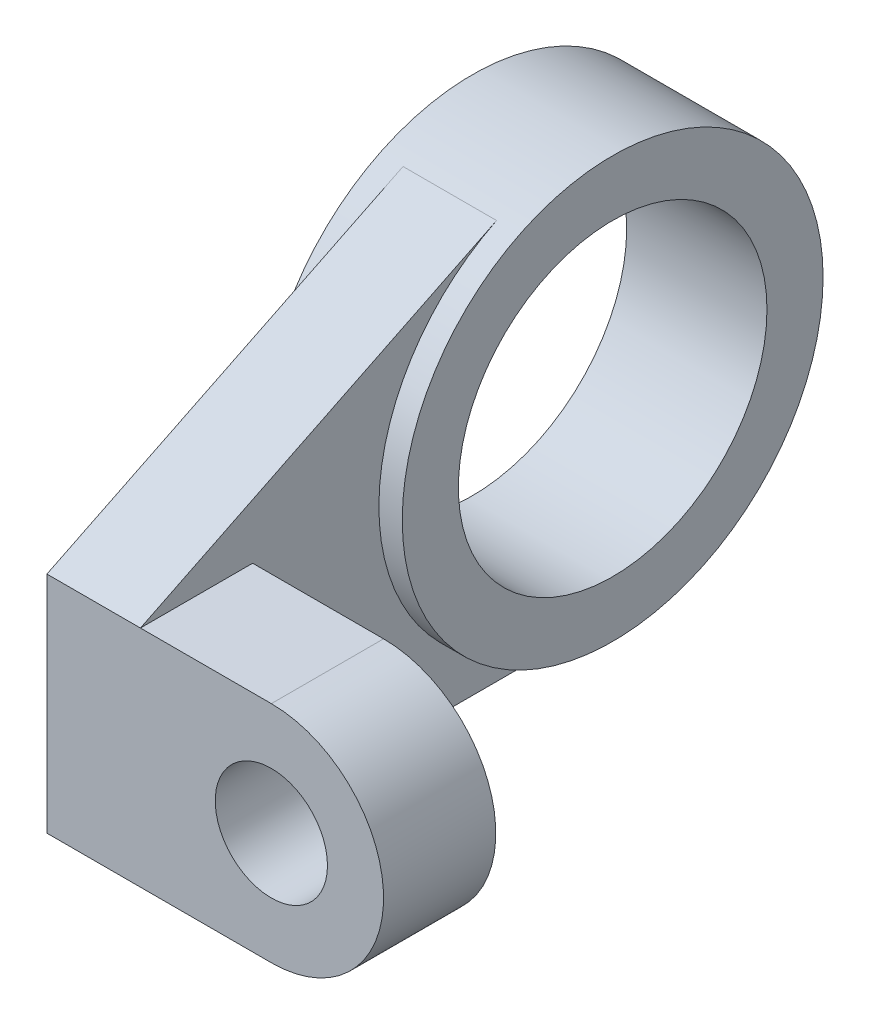
ISO-10303-21;
HEADER;
FILE_DESCRIPTION(('STEP AP214'),'2;1');
FILE_NAME('part.step','',(''),(''),'','','');
FILE_SCHEMA(('AUTOMOTIVE_DESIGN { 1 0 10303 214 1 1 1 1 }'));
ENDSEC;
DATA;
#1=APPLICATION_CONTEXT('core data for automotive mechanical design processes');
#2=APPLICATION_PROTOCOL_DEFINITION('international standard','automotive_design',2000,#1);
#3=PRODUCT_CONTEXT('',#1,'mechanical');
#4=PRODUCT('Part','Part','',(#3));
#5=PRODUCT_RELATED_PRODUCT_CATEGORY('part','',(#4));
#6=PRODUCT_DEFINITION_FORMATION('','',#4);
#7=PRODUCT_DEFINITION_CONTEXT('part definition',#1,'design');
#8=PRODUCT_DEFINITION('design','',#6,#7);
#9=PRODUCT_DEFINITION_SHAPE('','',#8);
#10=(LENGTH_UNIT() NAMED_UNIT(*) SI_UNIT(.MILLI.,.METRE.));
#11=(NAMED_UNIT(*) PLANE_ANGLE_UNIT() SI_UNIT($,.RADIAN.));
#12=(NAMED_UNIT(*) SI_UNIT($,.STERADIAN.) SOLID_ANGLE_UNIT());
#13=UNCERTAINTY_MEASURE_WITH_UNIT(LENGTH_MEASURE(1.E-05),#10,'distance_accuracy_value','');
#14=(GEOMETRIC_REPRESENTATION_CONTEXT(3) GLOBAL_UNCERTAINTY_ASSIGNED_CONTEXT((#13)) GLOBAL_UNIT_ASSIGNED_CONTEXT((#10,
#11,#12)) REPRESENTATION_CONTEXT('',''));
#15=CARTESIAN_POINT('',(0.,0.,0.));
#16=DIRECTION('',(0.,0.,1.));
#17=DIRECTION('',(1.,0.,0.));
#18=AXIS2_PLACEMENT_3D('',#15,#16,#17);
#19=CARTESIAN_POINT('',(10.,0.,0.));
#20=DIRECTION('',(1.,0.,0.));
#21=DIRECTION('',(0.,0.,-1.));
#22=AXIS2_PLACEMENT_3D('',#19,#20,#21);
#23=PLANE('',#22);
#24=DIRECTION('',(0.,0.440698271953696,-0.897655297481737));
#25=VECTOR('',#24,1.);
#26=CARTESIAN_POINT('',(10.,0.,0.));
#27=LINE('',#26,#25);
#28=CARTESIAN_POINT('',(10.,0.,0.));
#29=VERTEX_POINT('',#28);
#30=CARTESIAN_POINT('',(10.,37.3944883866782,-76.1685777620837));
#31=VERTEX_POINT('',#30);
#32=EDGE_CURVE('E144',#29,#31,#27,.T.);
#33=ORIENTED_EDGE('',*,*,#32,.F.);
#34=DIRECTION('',(0.,0.,1.));
#35=VECTOR('',#34,1.);
#36=CARTESIAN_POINT('',(10.,0.,-24.));
#37=LINE('',#36,#35);
#38=CARTESIAN_POINT('',(10.,0.,-24.));
#39=VERTEX_POINT('',#38);
#40=EDGE_CURVE('E48',#39,#29,#37,.T.);
#41=ORIENTED_EDGE('',*,*,#40,.F.);
#42=DIRECTION('',(0.,1.,0.));
#43=VECTOR('',#42,1.);
#44=CARTESIAN_POINT('',(10.,0.,-24.));
#45=LINE('',#44,#43);
#46=CARTESIAN_POINT('',(10.,-48.,-24.));
#47=VERTEX_POINT('',#46);
#48=EDGE_CURVE('E53',#47,#39,#45,.T.);
#49=ORIENTED_EDGE('',*,*,#48,.F.);
#50=DIRECTION('',(0.,0.,-1.));
#51=VECTOR('',#50,1.);
#52=CARTESIAN_POINT('',(10.,-48.,0.));
#53=LINE('',#52,#51);
#54=CARTESIAN_POINT('',(10.,-48.,-96.));
#55=VERTEX_POINT('',#54);
#56=EDGE_CURVE('E111',#47,#55,#53,.T.);
#57=ORIENTED_EDGE('',*,*,#56,.T.);
#58=CARTESIAN_POINT('',(10.,-3.,-96.));
#59=DIRECTION('',(1.,0.,0.));
#60=DIRECTION('',(0.,0.,-1.));
#61=AXIS2_PLACEMENT_3D('',#58,#59,#60);
#62=CIRCLE('',#61,45.);
#63=EDGE_CURVE('E141',#31,#55,#62,.T.);
#64=ORIENTED_EDGE('',*,*,#63,.F.);
#65=EDGE_LOOP('',(#33,#41,#49,#57,#64));
#66=FACE_BOUND('',#65,.T.);
#67=ADVANCED_FACE('F33',(#66),#23,.T.);
#68=CARTESIAN_POINT('',(10.,0.,0.));
#69=DIRECTION('',(0.,0.897655297481737,0.440698271953696));
#70=DIRECTION('',(0.,-0.440698271953696,0.897655297481737));
#71=AXIS2_PLACEMENT_3D('',#68,#69,#70);
#72=PLANE('',#71);
#73=DIRECTION('',(0.,0.440698271953696,-0.897655297481737));
#74=VECTOR('',#73,1.);
#75=CARTESIAN_POINT('',(-10.,0.,0.));
#76=LINE('',#75,#74);
#77=CARTESIAN_POINT('',(-10.,0.,0.));
#78=VERTEX_POINT('',#77);
#79=CARTESIAN_POINT('',(-10.,37.3944883866782,-76.1685777620837));
#80=VERTEX_POINT('',#79);
#81=EDGE_CURVE('E152',#78,#80,#76,.T.);
#82=ORIENTED_EDGE('',*,*,#81,.F.);
#83=DIRECTION('',(-1.,0.,0.));
#84=VECTOR('',#83,1.);
#85=CARTESIAN_POINT('',(10.,0.,0.));
#86=LINE('',#85,#84);
#87=EDGE_CURVE('E41',#29,#78,#86,.T.);
#88=ORIENTED_EDGE('',*,*,#87,.F.);
#89=ORIENTED_EDGE('',*,*,#32,.T.);
#90=DIRECTION('',(-1.,0.,0.));
#91=VECTOR('',#90,1.);
#92=CARTESIAN_POINT('',(10.,37.3944883866782,-76.1685777620837));
#93=LINE('',#92,#91);
#94=EDGE_CURVE('E11',#31,#80,#93,.T.);
#95=ORIENTED_EDGE('',*,*,#94,.T.);
#96=EDGE_LOOP('',(#82,#88,#89,#95));
#97=FACE_BOUND('',#96,.T.);
#98=ADVANCED_FACE('F35',(#97),#72,.T.);
#99=CARTESIAN_POINT('',(10.,0.,0.));
#100=DIRECTION('',(0.,0.,-1.));
#101=DIRECTION('',(0.,1.,0.));
#102=AXIS2_PLACEMENT_3D('',#99,#100,#101);
#103=PLANE('',#102);
#104=DIRECTION('',(0.,-1.,0.));
#105=VECTOR('',#104,1.);
#106=CARTESIAN_POINT('',(-10.,0.,0.));
#107=LINE('',#106,#105);
#108=CARTESIAN_POINT('',(-10.,-48.,0.));
#109=VERTEX_POINT('',#108);
#110=EDGE_CURVE('E155',#78,#109,#107,.T.);
#111=ORIENTED_EDGE('',*,*,#110,.T.);
#112=DIRECTION('',(-1.,0.,0.));
#113=VECTOR('',#112,1.);
#114=CARTESIAN_POINT('',(10.,-48.,0.));
#115=LINE('',#114,#113);
#116=CARTESIAN_POINT('',(38.,-48.,0.));
#117=VERTEX_POINT('',#116);
#118=EDGE_CURVE('E159',#117,#109,#115,.T.);
#119=ORIENTED_EDGE('',*,*,#118,.F.);
#120=CARTESIAN_POINT('',(38.,-24.,0.));
#121=DIRECTION('',(0.,0.,1.));
#122=DIRECTION('',(1.,0.,0.));
#123=AXIS2_PLACEMENT_3D('',#120,#121,#122);
#124=CIRCLE('',#123,24.);
#125=CARTESIAN_POINT('',(38.,0.,0.));
#126=VERTEX_POINT('',#125);
#127=EDGE_CURVE('E95',#117,#126,#124,.T.);
#128=ORIENTED_EDGE('',*,*,#127,.T.);
#129=DIRECTION('',(1.,0.,0.));
#130=VECTOR('',#129,1.);
#131=CARTESIAN_POINT('',(0.,0.,0.));
#132=LINE('',#131,#130);
#133=EDGE_CURVE('E115',#29,#126,#132,.T.);
#134=ORIENTED_EDGE('',*,*,#133,.F.);
#135=ORIENTED_EDGE('',*,*,#87,.T.);
#136=EDGE_LOOP('',(#111,#119,#128,#134,#135));
#137=FACE_BOUND('',#136,.T.);
#138=CARTESIAN_POINT('',(38.,-24.,0.));
#139=DIRECTION('',(0.,0.,1.));
#140=DIRECTION('',(1.,0.,0.));
#141=AXIS2_PLACEMENT_3D('',#138,#139,#140);
#142=CIRCLE('',#141,12.);
#143=CARTESIAN_POINT('',(50.,-24.,0.));
#144=VERTEX_POINT('',#143);
#145=EDGE_CURVE('E120',#144,#144,#142,.T.);
#146=ORIENTED_EDGE('',*,*,#145,.F.);
#147=EDGE_LOOP('',(#146));
#148=FACE_BOUND('',#147,.T.);
#149=ADVANCED_FACE('F163',(#137,#148),#103,.F.);
#150=CARTESIAN_POINT('',(10.,-48.,0.));
#151=DIRECTION('',(0.,1.,0.));
#152=DIRECTION('',(0.,0.,1.));
#153=AXIS2_PLACEMENT_3D('',#150,#151,#152);
#154=PLANE('',#153);
#155=DIRECTION('',(0.,0.,-1.));
#156=VECTOR('',#155,1.);
#157=CARTESIAN_POINT('',(-10.,-48.,0.));
#158=LINE('',#157,#156);
#159=CARTESIAN_POINT('',(-10.,-48.,-96.));
#160=VERTEX_POINT('',#159);
#161=EDGE_CURVE('E145',#109,#160,#158,.T.);
#162=ORIENTED_EDGE('',*,*,#161,.T.);
#163=DIRECTION('',(-1.,0.,0.));
#164=VECTOR('',#163,1.);
#165=CARTESIAN_POINT('',(10.,-48.,-96.));
#166=LINE('',#165,#164);
#167=EDGE_CURVE('E149',#55,#160,#166,.T.);
#168=ORIENTED_EDGE('',*,*,#167,.F.);
#169=ORIENTED_EDGE('',*,*,#56,.F.);
#170=DIRECTION('',(1.,0.,0.));
#171=VECTOR('',#170,1.);
#172=CARTESIAN_POINT('',(0.,-48.,-24.));
#173=LINE('',#172,#171);
#174=CARTESIAN_POINT('',(38.,-48.,-24.));
#175=VERTEX_POINT('',#174);
#176=EDGE_CURVE('E104',#47,#175,#173,.T.);
#177=ORIENTED_EDGE('',*,*,#176,.T.);
#178=DIRECTION('',(0.,0.,1.));
#179=VECTOR('',#178,1.);
#180=CARTESIAN_POINT('',(38.,-48.,-24.));
#181=LINE('',#180,#179);
#182=EDGE_CURVE('E90',#175,#117,#181,.T.);
#183=ORIENTED_EDGE('',*,*,#182,.T.);
#184=ORIENTED_EDGE('',*,*,#118,.T.);
#185=EDGE_LOOP('',(#162,#168,#169,#177,#183,#184));
#186=FACE_BOUND('',#185,.T.);
#187=ADVANCED_FACE('F109',(#186),#154,.F.);
#188=CARTESIAN_POINT('',(-10.,0.,0.));
#189=DIRECTION('',(1.,0.,0.));
#190=DIRECTION('',(0.,0.,-1.));
#191=AXIS2_PLACEMENT_3D('',#188,#189,#190);
#192=PLANE('',#191);
#193=CARTESIAN_POINT('',(-10.,-3.,-96.));
#194=DIRECTION('',(1.,0.,0.));
#195=DIRECTION('',(0.,0.,-1.));
#196=AXIS2_PLACEMENT_3D('',#193,#194,#195);
#197=CIRCLE('',#196,45.);
#198=EDGE_CURVE('E136',#80,#160,#197,.T.);
#199=ORIENTED_EDGE('',*,*,#198,.T.);
#200=ORIENTED_EDGE('',*,*,#161,.F.);
#201=ORIENTED_EDGE('',*,*,#110,.F.);
#202=ORIENTED_EDGE('',*,*,#81,.T.);
#203=EDGE_LOOP('',(#199,#200,#201,#202));
#204=FACE_BOUND('',#203,.T.);
#205=ADVANCED_FACE('F169',(#204),#192,.F.);
#206=CARTESIAN_POINT('',(15.,-3.,-96.));
#207=DIRECTION('',(-1.,0.,0.));
#208=DIRECTION('',(0.,0.,1.));
#209=AXIS2_PLACEMENT_3D('',#206,#207,#208);
#210=CYLINDRICAL_SURFACE('',#209,33.);
#211=CARTESIAN_POINT('',(15.,-3.,-96.));
#212=DIRECTION('',(1.,0.,0.));
#213=DIRECTION('',(0.,0.,-1.));
#214=AXIS2_PLACEMENT_3D('',#211,#212,#213);
#215=CIRCLE('',#214,33.);
#216=CARTESIAN_POINT('',(15.,-3.,-129.));
#217=VERTEX_POINT('',#216);
#218=EDGE_CURVE('E129',#217,#217,#215,.T.);
#219=ORIENTED_EDGE('',*,*,#218,.T.);
#220=EDGE_LOOP('',(#219));
#221=FACE_BOUND('',#220,.T.);
#222=CARTESIAN_POINT('',(-15.,-3.,-96.));
#223=DIRECTION('',(1.,0.,0.));
#224=DIRECTION('',(0.,0.,-1.));
#225=AXIS2_PLACEMENT_3D('',#222,#223,#224);
#226=CIRCLE('',#225,33.);
#227=CARTESIAN_POINT('',(-15.,-3.,-129.));
#228=VERTEX_POINT('',#227);
#229=EDGE_CURVE('E127',#228,#228,#226,.T.);
#230=ORIENTED_EDGE('',*,*,#229,.F.);
#231=EDGE_LOOP('',(#230));
#232=FACE_BOUND('',#231,.T.);
#233=ADVANCED_FACE('F181',(#221,#232),#210,.F.);
#234=CARTESIAN_POINT('',(15.,-3.,-96.));
#235=DIRECTION('',(-1.,0.,0.));
#236=DIRECTION('',(0.,0.,1.));
#237=AXIS2_PLACEMENT_3D('',#234,#235,#236);
#238=CYLINDRICAL_SURFACE('',#237,45.);
#239=ORIENTED_EDGE('',*,*,#63,.T.);
#240=ORIENTED_EDGE('',*,*,#167,.T.);
#241=ORIENTED_EDGE('',*,*,#198,.F.);
#242=ORIENTED_EDGE('',*,*,#94,.F.);
#243=EDGE_LOOP('',(#239,#240,#241,#242));
#244=FACE_BOUND('',#243,.T.);
#245=CARTESIAN_POINT('',(15.,-3.,-96.));
#246=DIRECTION('',(1.,0.,0.));
#247=DIRECTION('',(0.,0.,-1.));
#248=AXIS2_PLACEMENT_3D('',#245,#246,#247);
#249=CIRCLE('',#248,45.);
#250=CARTESIAN_POINT('',(15.,-3.,-141.));
#251=VERTEX_POINT('',#250);
#252=EDGE_CURVE('E132',#251,#251,#249,.T.);
#253=ORIENTED_EDGE('',*,*,#252,.F.);
#254=EDGE_LOOP('',(#253));
#255=FACE_BOUND('',#254,.T.);
#256=CARTESIAN_POINT('',(-15.,-3.,-96.));
#257=DIRECTION('',(1.,0.,0.));
#258=DIRECTION('',(0.,0.,-1.));
#259=AXIS2_PLACEMENT_3D('',#256,#257,#258);
#260=CIRCLE('',#259,45.);
#261=CARTESIAN_POINT('',(-15.,-3.,-141.));
#262=VERTEX_POINT('',#261);
#263=EDGE_CURVE('E133',#262,#262,#260,.T.);
#264=ORIENTED_EDGE('',*,*,#263,.T.);
#265=EDGE_LOOP('',(#264));
#266=FACE_BOUND('',#265,.T.);
#267=ADVANCED_FACE('F172',(#244,#255,#266),#238,.T.);
#268=CARTESIAN_POINT('',(15.,0.,0.));
#269=DIRECTION('',(1.,0.,0.));
#270=DIRECTION('',(0.,0.,-1.));
#271=AXIS2_PLACEMENT_3D('',#268,#269,#270);
#272=PLANE('',#271);
#273=ORIENTED_EDGE('',*,*,#218,.F.);
#274=EDGE_LOOP('',(#273));
#275=FACE_BOUND('',#274,.T.);
#276=ORIENTED_EDGE('',*,*,#252,.T.);
#277=EDGE_LOOP('',(#276));
#278=FACE_BOUND('',#277,.T.);
#279=ADVANCED_FACE('F212',(#275,#278),#272,.T.);
#280=CARTESIAN_POINT('',(-15.,0.,0.));
#281=DIRECTION('',(1.,0.,0.));
#282=DIRECTION('',(0.,0.,-1.));
#283=AXIS2_PLACEMENT_3D('',#280,#281,#282);
#284=PLANE('',#283);
#285=ORIENTED_EDGE('',*,*,#229,.T.);
#286=EDGE_LOOP('',(#285));
#287=FACE_BOUND('',#286,.T.);
#288=ORIENTED_EDGE('',*,*,#263,.F.);
#289=EDGE_LOOP('',(#288));
#290=FACE_BOUND('',#289,.T.);
#291=ADVANCED_FACE('F218',(#287,#290),#284,.F.);
#292=CARTESIAN_POINT('',(0.,0.,-24.));
#293=DIRECTION('',(0.,-1.,0.));
#294=DIRECTION('',(0.,0.,-1.));
#295=AXIS2_PLACEMENT_3D('',#292,#293,#294);
#296=PLANE('',#295);
#297=ORIENTED_EDGE('',*,*,#133,.T.);
#298=DIRECTION('',(0.,0.,1.));
#299=VECTOR('',#298,1.);
#300=CARTESIAN_POINT('',(38.,0.,-24.));
#301=LINE('',#300,#299);
#302=CARTESIAN_POINT('',(38.,0.,-24.));
#303=VERTEX_POINT('',#302);
#304=EDGE_CURVE('E99',#303,#126,#301,.T.);
#305=ORIENTED_EDGE('',*,*,#304,.F.);
#306=DIRECTION('',(1.,0.,0.));
#307=VECTOR('',#306,1.);
#308=CARTESIAN_POINT('',(0.,0.,-24.));
#309=LINE('',#308,#307);
#310=EDGE_CURVE('E105',#39,#303,#309,.T.);
#311=ORIENTED_EDGE('',*,*,#310,.F.);
#312=ORIENTED_EDGE('',*,*,#40,.T.);
#313=EDGE_LOOP('',(#297,#305,#311,#312));
#314=FACE_BOUND('',#313,.T.);
#315=ADVANCED_FACE('F226',(#314),#296,.F.);
#316=CARTESIAN_POINT('',(38.,-24.,-24.));
#317=DIRECTION('',(0.,0.,1.));
#318=DIRECTION('',(1.,0.,0.));
#319=AXIS2_PLACEMENT_3D('',#316,#317,#318);
#320=CYLINDRICAL_SURFACE('',#319,12.);
#321=CARTESIAN_POINT('',(38.,-24.,-24.));
#322=DIRECTION('',(0.,0.,1.));
#323=DIRECTION('',(1.,0.,0.));
#324=AXIS2_PLACEMENT_3D('',#321,#322,#323);
#325=CIRCLE('',#324,12.);
#326=CARTESIAN_POINT('',(50.,-24.,-24.));
#327=VERTEX_POINT('',#326);
#328=EDGE_CURVE('E112',#327,#327,#325,.T.);
#329=ORIENTED_EDGE('',*,*,#328,.F.);
#330=EDGE_LOOP('',(#329));
#331=FACE_BOUND('',#330,.T.);
#332=ORIENTED_EDGE('',*,*,#145,.T.);
#333=EDGE_LOOP('',(#332));
#334=FACE_BOUND('',#333,.T.);
#335=ADVANCED_FACE('F233',(#331,#334),#320,.F.);
#336=CARTESIAN_POINT('',(38.,-24.,-24.));
#337=DIRECTION('',(0.,0.,1.));
#338=DIRECTION('',(1.,0.,0.));
#339=AXIS2_PLACEMENT_3D('',#336,#337,#338);
#340=CYLINDRICAL_SURFACE('',#339,24.);
#341=ORIENTED_EDGE('',*,*,#127,.F.);
#342=ORIENTED_EDGE('',*,*,#182,.F.);
#343=CARTESIAN_POINT('',(38.,-24.,-24.));
#344=DIRECTION('',(0.,0.,1.));
#345=DIRECTION('',(1.,0.,0.));
#346=AXIS2_PLACEMENT_3D('',#343,#344,#345);
#347=CIRCLE('',#346,24.);
#348=EDGE_CURVE('E93',#175,#303,#347,.T.);
#349=ORIENTED_EDGE('',*,*,#348,.T.);
#350=ORIENTED_EDGE('',*,*,#304,.T.);
#351=EDGE_LOOP('',(#341,#342,#349,#350));
#352=FACE_BOUND('',#351,.T.);
#353=ADVANCED_FACE('F92',(#352),#340,.T.);
#354=CARTESIAN_POINT('',(0.,0.,-24.));
#355=DIRECTION('',(0.,0.,1.));
#356=DIRECTION('',(1.,0.,0.));
#357=AXIS2_PLACEMENT_3D('',#354,#355,#356);
#358=PLANE('',#357);
#359=ORIENTED_EDGE('',*,*,#328,.T.);
#360=EDGE_LOOP('',(#359));
#361=FACE_BOUND('',#360,.T.);
#362=ORIENTED_EDGE('',*,*,#176,.F.);
#363=ORIENTED_EDGE('',*,*,#48,.T.);
#364=ORIENTED_EDGE('',*,*,#310,.T.);
#365=ORIENTED_EDGE('',*,*,#348,.F.);
#366=EDGE_LOOP('',(#362,#363,#364,#365));
#367=FACE_BOUND('',#366,.T.);
#368=ADVANCED_FACE('F103',(#361,#367),#358,.F.);
#369=CLOSED_SHELL('',(#67,#98,#149,#187,#205,#233,#267,#279,#291,#315,#335,#353,#368));
#370=MANIFOLD_SOLID_BREP('B2',#369);
#371=ADVANCED_BREP_SHAPE_REPRESENTATION('',(#18,#370),#14);
#372=SHAPE_DEFINITION_REPRESENTATION(#9,#371);
ENDSEC;
END-ISO-10303-21;
